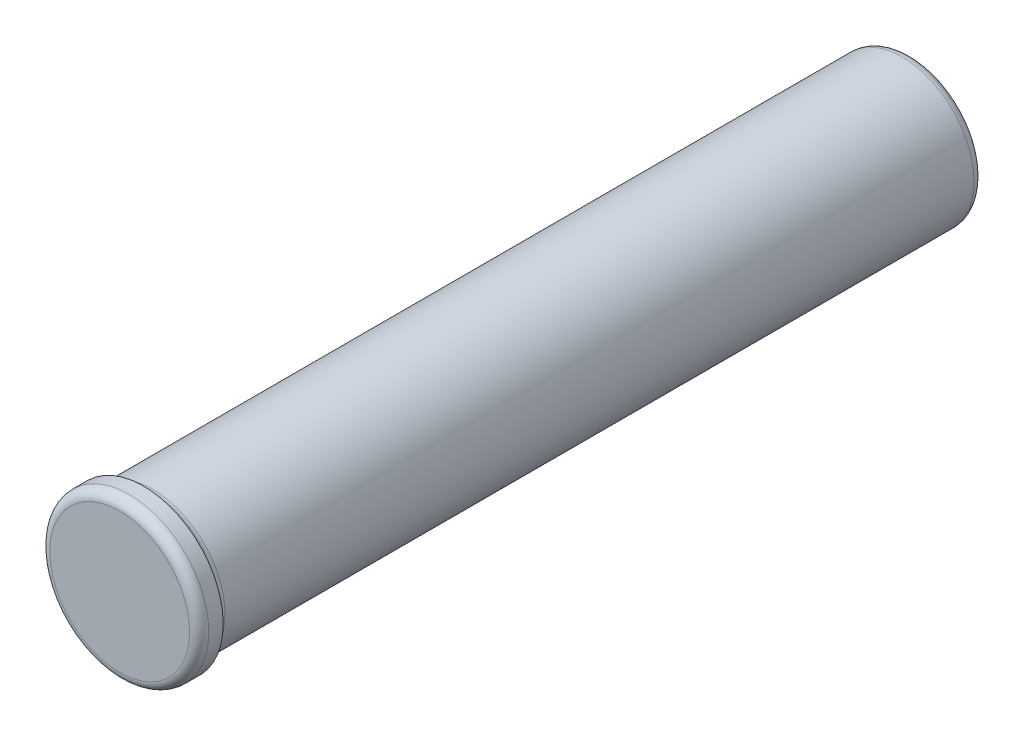
ISO-10303-21;
HEADER;
FILE_DESCRIPTION(('STEP AP214'),'2;1');
FILE_NAME('part.step','',(''),(''),'','','');
FILE_SCHEMA(('AUTOMOTIVE_DESIGN { 1 0 10303 214 1 1 1 1 }'));
ENDSEC;
DATA;
#1=APPLICATION_CONTEXT('core data for automotive mechanical design processes');
#2=APPLICATION_PROTOCOL_DEFINITION('international standard','automotive_design',2000,#1);
#3=PRODUCT_CONTEXT('',#1,'mechanical');
#4=PRODUCT('Part','Part','',(#3));
#5=PRODUCT_RELATED_PRODUCT_CATEGORY('part','',(#4));
#6=PRODUCT_DEFINITION_FORMATION('','',#4);
#7=PRODUCT_DEFINITION_CONTEXT('part definition',#1,'design');
#8=PRODUCT_DEFINITION('design','',#6,#7);
#9=PRODUCT_DEFINITION_SHAPE('','',#8);
#10=(LENGTH_UNIT() NAMED_UNIT(*) SI_UNIT(.MILLI.,.METRE.));
#11=(NAMED_UNIT(*) PLANE_ANGLE_UNIT() SI_UNIT($,.RADIAN.));
#12=(NAMED_UNIT(*) SI_UNIT($,.STERADIAN.) SOLID_ANGLE_UNIT());
#13=UNCERTAINTY_MEASURE_WITH_UNIT(LENGTH_MEASURE(1.E-05),#10,'distance_accuracy_value','');
#14=(GEOMETRIC_REPRESENTATION_CONTEXT(3) GLOBAL_UNCERTAINTY_ASSIGNED_CONTEXT((#13)) GLOBAL_UNIT_ASSIGNED_CONTEXT((#10,
#11,#12)) REPRESENTATION_CONTEXT('',''));
#15=CARTESIAN_POINT('',(0.,0.,0.));
#16=DIRECTION('',(0.,0.,1.));
#17=DIRECTION('',(1.,0.,0.));
#18=AXIS2_PLACEMENT_3D('',#15,#16,#17);
#19=CARTESIAN_POINT('',(0.,0.,1.65));
#20=DIRECTION('',(0.,0.,-1.));
#21=DIRECTION('',(-1.,0.,0.));
#22=AXIS2_PLACEMENT_3D('',#19,#20,#21);
#23=CYLINDRICAL_SURFACE('',#22,0.15);
#24=CARTESIAN_POINT('',(0.,0.,0.0200000000000001));
#25=DIRECTION('',(0.,0.,1.));
#26=DIRECTION('',(1.,0.,0.));
#27=AXIS2_PLACEMENT_3D('',#24,#25,#26);
#28=CIRCLE('',#27,0.15);
#29=CARTESIAN_POINT('',(0.15,0.,0.0200000000000001));
#30=VERTEX_POINT('',#29);
#31=EDGE_CURVE('E38',#30,#30,#28,.T.);
#32=ORIENTED_EDGE('',*,*,#31,.T.);
#33=EDGE_LOOP('',(#32));
#34=FACE_BOUND('',#33,.T.);
#35=CARTESIAN_POINT('',(0.,0.,1.58049402010985));
#36=DIRECTION('',(0.,0.,1.));
#37=DIRECTION('',(1.,0.,0.));
#38=AXIS2_PLACEMENT_3D('',#35,#36,#37);
#39=CIRCLE('',#38,0.15);
#40=CARTESIAN_POINT('',(0.15,0.,1.58049402010985));
#41=VERTEX_POINT('',#40);
#42=EDGE_CURVE('E42',#41,#41,#39,.F.);
#43=ORIENTED_EDGE('',*,*,#42,.T.);
#44=EDGE_LOOP('',(#43));
#45=FACE_BOUND('',#44,.T.);
#46=ADVANCED_FACE('F31',(#34,#45),#23,.T.);
#47=CARTESIAN_POINT('',(0.,0.,0.));
#48=DIRECTION('',(0.,0.,1.));
#49=DIRECTION('',(1.,0.,0.));
#50=AXIS2_PLACEMENT_3D('',#47,#48,#49);
#51=PLANE('',#50);
#52=CARTESIAN_POINT('',(0.,0.,0.));
#53=DIRECTION('',(0.,0.,1.));
#54=DIRECTION('',(1.,0.,0.));
#55=AXIS2_PLACEMENT_3D('',#52,#53,#54);
#56=CIRCLE('',#55,0.13);
#57=CARTESIAN_POINT('',(0.13,0.,0.));
#58=VERTEX_POINT('',#57);
#59=EDGE_CURVE('E10',#58,#58,#56,.F.);
#60=ORIENTED_EDGE('',*,*,#59,.T.);
#61=EDGE_LOOP('',(#60));
#62=FACE_BOUND('',#61,.T.);
#63=ADVANCED_FACE('F74',(#62),#51,.F.);
#64=CARTESIAN_POINT('',(0.,0.,1.6));
#65=DIRECTION('',(0.,0.,1.));
#66=DIRECTION('',(1.,0.,0.));
#67=AXIS2_PLACEMENT_3D('',#64,#65,#66);
#68=CYLINDRICAL_SURFACE('',#67,0.165582223576821);
#69=CARTESIAN_POINT('',(0.,0.,1.63));
#70=DIRECTION('',(0.,0.,1.));
#71=DIRECTION('',(1.,0.,0.));
#72=AXIS2_PLACEMENT_3D('',#69,#70,#71);
#73=CIRCLE('',#72,0.165582223576821);
#74=CARTESIAN_POINT('',(0.165582223576821,0.,1.63));
#75=VERTEX_POINT('',#74);
#76=EDGE_CURVE('E46',#75,#75,#73,.F.);
#77=ORIENTED_EDGE('',*,*,#76,.T.);
#78=EDGE_LOOP('',(#77));
#79=FACE_BOUND('',#78,.T.);
#80=CARTESIAN_POINT('',(0.,0.,1.6));
#81=DIRECTION('',(0.,0.,1.));
#82=DIRECTION('',(1.,0.,0.));
#83=AXIS2_PLACEMENT_3D('',#80,#81,#82);
#84=CIRCLE('',#83,0.165582223576821);
#85=CARTESIAN_POINT('',(0.165582223576821,0.,1.6));
#86=VERTEX_POINT('',#85);
#87=EDGE_CURVE('E54',#86,#86,#84,.T.);
#88=ORIENTED_EDGE('',*,*,#87,.T.);
#89=EDGE_LOOP('',(#88));
#90=FACE_BOUND('',#89,.T.);
#91=ADVANCED_FACE('F58',(#79,#90),#68,.T.);
#92=CARTESIAN_POINT('',(0.,0.,1.65));
#93=DIRECTION('',(0.,0.,1.));
#94=DIRECTION('',(1.,0.,0.));
#95=AXIS2_PLACEMENT_3D('',#92,#93,#94);
#96=PLANE('',#95);
#97=CARTESIAN_POINT('',(0.,0.,1.65));
#98=DIRECTION('',(0.,0.,1.));
#99=DIRECTION('',(1.,0.,0.));
#100=AXIS2_PLACEMENT_3D('',#97,#98,#99);
#101=CIRCLE('',#100,0.145582223576821);
#102=CARTESIAN_POINT('',(0.145582223576821,0.,1.65));
#103=VERTEX_POINT('',#102);
#104=EDGE_CURVE('E51',#103,#103,#101,.T.);
#105=ORIENTED_EDGE('',*,*,#104,.T.);
#106=EDGE_LOOP('',(#105));
#107=FACE_BOUND('',#106,.T.);
#108=ADVANCED_FACE('F69',(#107),#96,.T.);
#109=CARTESIAN_POINT('',(0.,0.,1.63));
#110=DIRECTION('',(0.,0.,1.));
#111=DIRECTION('',(1.,0.,0.));
#112=AXIS2_PLACEMENT_3D('',#109,#110,#111);
#113=TOROIDAL_SURFACE('',#112,0.145582223576821,0.02);
#114=ORIENTED_EDGE('',*,*,#76,.F.);
#115=EDGE_LOOP('',(#114));
#116=FACE_BOUND('',#115,.T.);
#117=ORIENTED_EDGE('',*,*,#104,.F.);
#118=EDGE_LOOP('',(#117));
#119=FACE_BOUND('',#118,.T.);
#120=ADVANCED_FACE('F62',(#116,#119),#113,.T.);
#121=CARTESIAN_POINT('',(0.,0.,1.58049402010985));
#122=DIRECTION('',(0.,0.,1.));
#123=DIRECTION('',(1.,0.,0.));
#124=AXIS2_PLACEMENT_3D('',#121,#122,#123);
#125=TOROIDAL_SURFACE('',#124,0.17,0.02);
#126=ORIENTED_EDGE('',*,*,#42,.F.);
#127=EDGE_LOOP('',(#126));
#128=FACE_BOUND('',#127,.T.);
#129=ORIENTED_EDGE('',*,*,#87,.F.);
#130=EDGE_LOOP('',(#129));
#131=FACE_BOUND('',#130,.T.);
#132=ADVANCED_FACE('F60',(#128,#131),#125,.F.);
#133=CARTESIAN_POINT('',(0.,0.,0.0200000000000001));
#134=DIRECTION('',(0.,0.,1.));
#135=DIRECTION('',(1.,0.,0.));
#136=AXIS2_PLACEMENT_3D('',#133,#134,#135);
#137=TOROIDAL_SURFACE('',#136,0.13,0.02);
#138=ORIENTED_EDGE('',*,*,#59,.F.);
#139=EDGE_LOOP('',(#138));
#140=FACE_BOUND('',#139,.T.);
#141=ORIENTED_EDGE('',*,*,#31,.F.);
#142=EDGE_LOOP('',(#141));
#143=FACE_BOUND('',#142,.T.);
#144=ADVANCED_FACE('F33',(#140,#143),#137,.T.);
#145=CLOSED_SHELL('',(#46,#63,#91,#108,#120,#132,#144));
#146=MANIFOLD_SOLID_BREP('B2',#145);
#147=ADVANCED_BREP_SHAPE_REPRESENTATION('',(#18,#146),#14);
#148=SHAPE_DEFINITION_REPRESENTATION(#9,#147);
ENDSEC;
END-ISO-10303-21;
